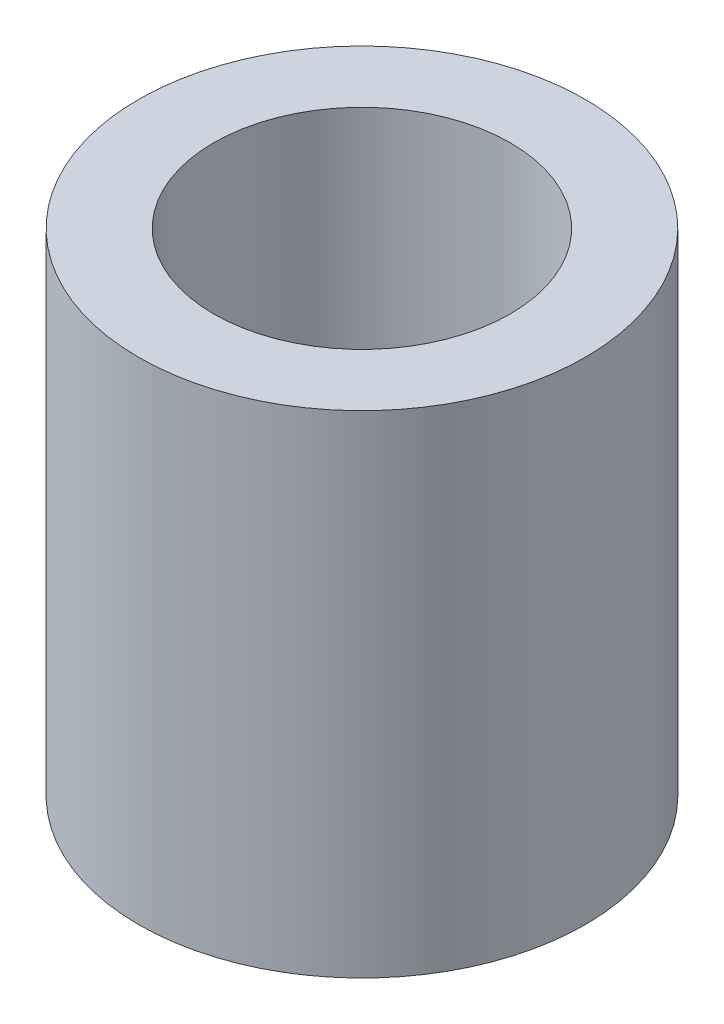
ISO-10303-21;
HEADER;
FILE_DESCRIPTION(('STEP AP214'),'2;1');
FILE_NAME('part.step','',(''),(''),'','','');
FILE_SCHEMA(('AUTOMOTIVE_DESIGN { 1 0 10303 214 1 1 1 1 }'));
ENDSEC;
DATA;
#1=APPLICATION_CONTEXT('core data for automotive mechanical design processes');
#2=APPLICATION_PROTOCOL_DEFINITION('international standard','automotive_design',2000,#1);
#3=PRODUCT_CONTEXT('',#1,'mechanical');
#4=PRODUCT('Part','Part','',(#3));
#5=PRODUCT_RELATED_PRODUCT_CATEGORY('part','',(#4));
#6=PRODUCT_DEFINITION_FORMATION('','',#4);
#7=PRODUCT_DEFINITION_CONTEXT('part definition',#1,'design');
#8=PRODUCT_DEFINITION('design','',#6,#7);
#9=PRODUCT_DEFINITION_SHAPE('','',#8);
#10=(LENGTH_UNIT() NAMED_UNIT(*) SI_UNIT(.MILLI.,.METRE.));
#11=(NAMED_UNIT(*) PLANE_ANGLE_UNIT() SI_UNIT($,.RADIAN.));
#12=(NAMED_UNIT(*) SI_UNIT($,.STERADIAN.) SOLID_ANGLE_UNIT());
#13=UNCERTAINTY_MEASURE_WITH_UNIT(LENGTH_MEASURE(1.E-05),#10,'distance_accuracy_value','');
#14=(GEOMETRIC_REPRESENTATION_CONTEXT(3) GLOBAL_UNCERTAINTY_ASSIGNED_CONTEXT((#13)) GLOBAL_UNIT_ASSIGNED_CONTEXT((#10,
#11,#12)) REPRESENTATION_CONTEXT('',''));
#15=CARTESIAN_POINT('',(0.,0.,0.));
#16=DIRECTION('',(0.,0.,1.));
#17=DIRECTION('',(1.,0.,0.));
#18=AXIS2_PLACEMENT_3D('',#15,#16,#17);
#19=CARTESIAN_POINT('',(0.,13.97,0.));
#20=DIRECTION('',(0.,-1.,0.));
#21=DIRECTION('',(0.,0.,-1.));
#22=AXIS2_PLACEMENT_3D('',#19,#20,#21);
#23=CYLINDRICAL_SURFACE('',#22,6.35);
#24=CARTESIAN_POINT('',(0.,13.97,0.));
#25=DIRECTION('',(0.,1.,0.));
#26=DIRECTION('',(0.,0.,1.));
#27=AXIS2_PLACEMENT_3D('',#24,#25,#26);
#28=CIRCLE('',#27,6.35);
#29=CARTESIAN_POINT('',(0.,13.97,6.35));
#30=VERTEX_POINT('',#29);
#31=EDGE_CURVE('E10',#30,#30,#28,.T.);
#32=ORIENTED_EDGE('',*,*,#31,.F.);
#33=EDGE_LOOP('',(#32));
#34=FACE_BOUND('',#33,.T.);
#35=CARTESIAN_POINT('',(0.,0.,0.));
#36=DIRECTION('',(0.,1.,0.));
#37=DIRECTION('',(0.,0.,1.));
#38=AXIS2_PLACEMENT_3D('',#35,#36,#37);
#39=CIRCLE('',#38,6.35);
#40=CARTESIAN_POINT('',(0.,0.,6.35));
#41=VERTEX_POINT('',#40);
#42=EDGE_CURVE('E40',#41,#41,#39,.T.);
#43=ORIENTED_EDGE('',*,*,#42,.T.);
#44=EDGE_LOOP('',(#43));
#45=FACE_BOUND('',#44,.T.);
#46=ADVANCED_FACE('F37',(#34,#45),#23,.T.);
#47=CARTESIAN_POINT('',(0.,13.97,0.));
#48=DIRECTION('',(0.,1.,0.));
#49=DIRECTION('',(0.,0.,1.));
#50=AXIS2_PLACEMENT_3D('',#47,#48,#49);
#51=PLANE('',#50);
#52=CARTESIAN_POINT('',(0.,13.97,0.));
#53=DIRECTION('',(0.,1.,0.));
#54=DIRECTION('',(0.,0.,1.));
#55=AXIS2_PLACEMENT_3D('',#52,#53,#54);
#56=CIRCLE('',#55,4.2164);
#57=CARTESIAN_POINT('',(0.,13.97,4.2164));
#58=VERTEX_POINT('',#57);
#59=EDGE_CURVE('E51',#58,#58,#56,.T.);
#60=ORIENTED_EDGE('',*,*,#59,.F.);
#61=EDGE_LOOP('',(#60));
#62=FACE_BOUND('',#61,.T.);
#63=ORIENTED_EDGE('',*,*,#31,.T.);
#64=EDGE_LOOP('',(#63));
#65=FACE_BOUND('',#64,.T.);
#66=ADVANCED_FACE('F57',(#62,#65),#51,.T.);
#67=CARTESIAN_POINT('',(0.,0.,0.));
#68=DIRECTION('',(0.,1.,0.));
#69=DIRECTION('',(0.,0.,1.));
#70=AXIS2_PLACEMENT_3D('',#67,#68,#69);
#71=PLANE('',#70);
#72=CARTESIAN_POINT('',(0.,0.,0.));
#73=DIRECTION('',(0.,1.,0.));
#74=DIRECTION('',(0.,0.,1.));
#75=AXIS2_PLACEMENT_3D('',#72,#73,#74);
#76=CIRCLE('',#75,4.2164);
#77=CARTESIAN_POINT('',(0.,0.,4.2164));
#78=VERTEX_POINT('',#77);
#79=EDGE_CURVE('E47',#78,#78,#76,.T.);
#80=ORIENTED_EDGE('',*,*,#79,.T.);
#81=EDGE_LOOP('',(#80));
#82=FACE_BOUND('',#81,.T.);
#83=ORIENTED_EDGE('',*,*,#42,.F.);
#84=EDGE_LOOP('',(#83));
#85=FACE_BOUND('',#84,.T.);
#86=ADVANCED_FACE('F59',(#82,#85),#71,.F.);
#87=CARTESIAN_POINT('',(0.,13.97,0.));
#88=DIRECTION('',(0.,1.,0.));
#89=DIRECTION('',(0.,0.,1.));
#90=AXIS2_PLACEMENT_3D('',#87,#88,#89);
#91=CYLINDRICAL_SURFACE('',#90,4.2164);
#92=ORIENTED_EDGE('',*,*,#79,.F.);
#93=EDGE_LOOP('',(#92));
#94=FACE_BOUND('',#93,.T.);
#95=ORIENTED_EDGE('',*,*,#59,.T.);
#96=EDGE_LOOP('',(#95));
#97=FACE_BOUND('',#96,.T.);
#98=ADVANCED_FACE('F55',(#94,#97),#91,.F.);
#99=CLOSED_SHELL('',(#46,#66,#86,#98));
#100=MANIFOLD_SOLID_BREP('B2',#99);
#101=ADVANCED_BREP_SHAPE_REPRESENTATION('',(#18,#100),#14);
#102=SHAPE_DEFINITION_REPRESENTATION(#9,#101);
ENDSEC;
END-ISO-10303-21;
